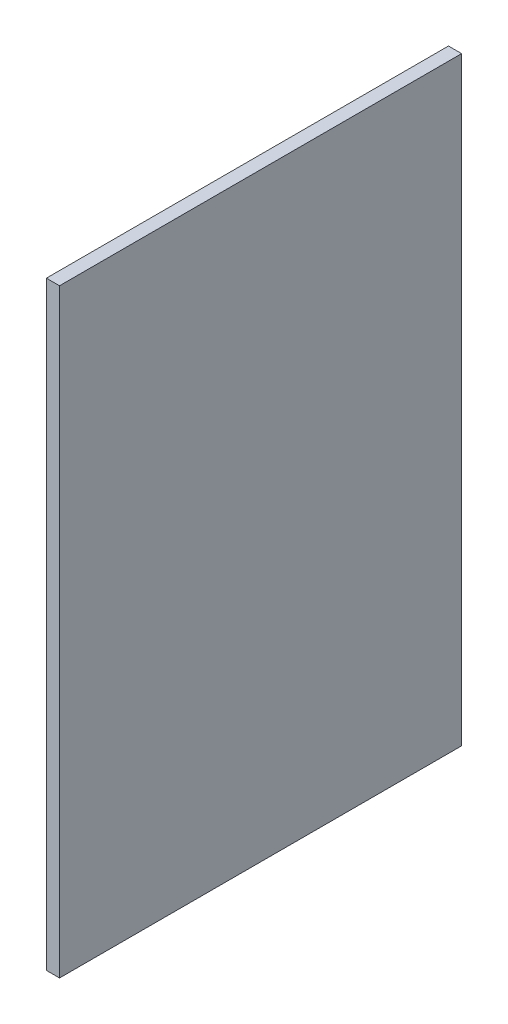
ISO-10303-21;
HEADER;
FILE_DESCRIPTION(('STEP AP214'),'2;1');
FILE_NAME('part.step','',(''),(''),'','','');
FILE_SCHEMA(('AUTOMOTIVE_DESIGN { 1 0 10303 214 1 1 1 1 }'));
ENDSEC;
DATA;
#1=APPLICATION_CONTEXT('core data for automotive mechanical design processes');
#2=APPLICATION_PROTOCOL_DEFINITION('international standard','automotive_design',2000,#1);
#3=PRODUCT_CONTEXT('',#1,'mechanical');
#4=PRODUCT('Part','Part','',(#3));
#5=PRODUCT_RELATED_PRODUCT_CATEGORY('part','',(#4));
#6=PRODUCT_DEFINITION_FORMATION('','',#4);
#7=PRODUCT_DEFINITION_CONTEXT('part definition',#1,'design');
#8=PRODUCT_DEFINITION('design','',#6,#7);
#9=PRODUCT_DEFINITION_SHAPE('','',#8);
#10=(LENGTH_UNIT() NAMED_UNIT(*) SI_UNIT(.MILLI.,.METRE.));
#11=(NAMED_UNIT(*) PLANE_ANGLE_UNIT() SI_UNIT($,.RADIAN.));
#12=(NAMED_UNIT(*) SI_UNIT($,.STERADIAN.) SOLID_ANGLE_UNIT());
#13=UNCERTAINTY_MEASURE_WITH_UNIT(LENGTH_MEASURE(1.E-05),#10,'distance_accuracy_value','');
#14=(GEOMETRIC_REPRESENTATION_CONTEXT(3) GLOBAL_UNCERTAINTY_ASSIGNED_CONTEXT((#13)) GLOBAL_UNIT_ASSIGNED_CONTEXT((#10,
#11,#12)) REPRESENTATION_CONTEXT('',''));
#15=CARTESIAN_POINT('',(0.,0.,0.));
#16=DIRECTION('',(0.,0.,1.));
#17=DIRECTION('',(1.,0.,0.));
#18=AXIS2_PLACEMENT_3D('',#15,#16,#17);
#19=CARTESIAN_POINT('',(18.,410.,-275.));
#20=DIRECTION('',(0.,0.,1.));
#21=DIRECTION('',(0.,-1.,0.));
#22=AXIS2_PLACEMENT_3D('',#19,#20,#21);
#23=PLANE('',#22);
#24=DIRECTION('',(0.,1.,0.));
#25=VECTOR('',#24,1.);
#26=CARTESIAN_POINT('',(0.,410.,-275.));
#27=LINE('',#26,#25);
#28=CARTESIAN_POINT('',(0.,-410.,-275.));
#29=VERTEX_POINT('',#28);
#30=CARTESIAN_POINT('',(0.,410.,-275.));
#31=VERTEX_POINT('',#30);
#32=EDGE_CURVE('E107',#29,#31,#27,.T.);
#33=ORIENTED_EDGE('',*,*,#32,.T.);
#34=DIRECTION('',(-1.,0.,0.));
#35=VECTOR('',#34,1.);
#36=CARTESIAN_POINT('',(18.,410.,-275.));
#37=LINE('',#36,#35);
#38=CARTESIAN_POINT('',(18.,410.,-275.));
#39=VERTEX_POINT('',#38);
#40=EDGE_CURVE('E11',#39,#31,#37,.T.);
#41=ORIENTED_EDGE('',*,*,#40,.F.);
#42=DIRECTION('',(0.,1.,0.));
#43=VECTOR('',#42,1.);
#44=CARTESIAN_POINT('',(18.,410.,-275.));
#45=LINE('',#44,#43);
#46=CARTESIAN_POINT('',(18.,-410.,-275.));
#47=VERTEX_POINT('',#46);
#48=EDGE_CURVE('E91',#47,#39,#45,.T.);
#49=ORIENTED_EDGE('',*,*,#48,.F.);
#50=DIRECTION('',(-1.,0.,0.));
#51=VECTOR('',#50,1.);
#52=CARTESIAN_POINT('',(18.,-410.,-275.));
#53=LINE('',#52,#51);
#54=EDGE_CURVE('E103',#47,#29,#53,.T.);
#55=ORIENTED_EDGE('',*,*,#54,.T.);
#56=EDGE_LOOP('',(#33,#41,#49,#55));
#57=FACE_BOUND('',#56,.T.);
#58=ADVANCED_FACE('F39',(#57),#23,.F.);
#59=CARTESIAN_POINT('',(18.,410.,275.));
#60=DIRECTION('',(0.,-1.,0.));
#61=DIRECTION('',(0.,0.,-1.));
#62=AXIS2_PLACEMENT_3D('',#59,#60,#61);
#63=PLANE('',#62);
#64=DIRECTION('',(0.,0.,1.));
#65=VECTOR('',#64,1.);
#66=CARTESIAN_POINT('',(0.,410.,275.));
#67=LINE('',#66,#65);
#68=CARTESIAN_POINT('',(0.,410.,275.));
#69=VERTEX_POINT('',#68);
#70=EDGE_CURVE('E96',#31,#69,#67,.T.);
#71=ORIENTED_EDGE('',*,*,#70,.T.);
#72=DIRECTION('',(-1.,0.,0.));
#73=VECTOR('',#72,1.);
#74=CARTESIAN_POINT('',(18.,410.,275.));
#75=LINE('',#74,#73);
#76=CARTESIAN_POINT('',(18.,410.,275.));
#77=VERTEX_POINT('',#76);
#78=EDGE_CURVE('E48',#77,#69,#75,.T.);
#79=ORIENTED_EDGE('',*,*,#78,.F.);
#80=DIRECTION('',(0.,0.,1.));
#81=VECTOR('',#80,1.);
#82=CARTESIAN_POINT('',(18.,410.,275.));
#83=LINE('',#82,#81);
#84=EDGE_CURVE('E86',#39,#77,#83,.T.);
#85=ORIENTED_EDGE('',*,*,#84,.F.);
#86=ORIENTED_EDGE('',*,*,#40,.T.);
#87=EDGE_LOOP('',(#71,#79,#85,#86));
#88=FACE_BOUND('',#87,.T.);
#89=ADVANCED_FACE('F95',(#88),#63,.F.);
#90=CARTESIAN_POINT('',(18.,410.,275.));
#91=DIRECTION('',(0.,0.,-1.));
#92=DIRECTION('',(0.,1.,0.));
#93=AXIS2_PLACEMENT_3D('',#90,#91,#92);
#94=PLANE('',#93);
#95=DIRECTION('',(0.,-1.,0.));
#96=VECTOR('',#95,1.);
#97=CARTESIAN_POINT('',(0.,410.,275.));
#98=LINE('',#97,#96);
#99=CARTESIAN_POINT('',(0.,-410.,275.));
#100=VERTEX_POINT('',#99);
#101=EDGE_CURVE('E73',#69,#100,#98,.T.);
#102=ORIENTED_EDGE('',*,*,#101,.T.);
#103=DIRECTION('',(-1.,0.,0.));
#104=VECTOR('',#103,1.);
#105=CARTESIAN_POINT('',(18.,-410.,275.));
#106=LINE('',#105,#104);
#107=CARTESIAN_POINT('',(18.,-410.,275.));
#108=VERTEX_POINT('',#107);
#109=EDGE_CURVE('E98',#108,#100,#106,.T.);
#110=ORIENTED_EDGE('',*,*,#109,.F.);
#111=DIRECTION('',(0.,-1.,0.));
#112=VECTOR('',#111,1.);
#113=CARTESIAN_POINT('',(18.,410.,275.));
#114=LINE('',#113,#112);
#115=EDGE_CURVE('E89',#77,#108,#114,.T.);
#116=ORIENTED_EDGE('',*,*,#115,.F.);
#117=ORIENTED_EDGE('',*,*,#78,.T.);
#118=EDGE_LOOP('',(#102,#110,#116,#117));
#119=FACE_BOUND('',#118,.T.);
#120=ADVANCED_FACE('F99',(#119),#94,.F.);
#121=CARTESIAN_POINT('',(18.,-410.,275.));
#122=DIRECTION('',(0.,1.,0.));
#123=DIRECTION('',(0.,0.,1.));
#124=AXIS2_PLACEMENT_3D('',#121,#122,#123);
#125=PLANE('',#124);
#126=DIRECTION('',(0.,0.,-1.));
#127=VECTOR('',#126,1.);
#128=CARTESIAN_POINT('',(0.,-410.,275.));
#129=LINE('',#128,#127);
#130=EDGE_CURVE('E79',#100,#29,#129,.T.);
#131=ORIENTED_EDGE('',*,*,#130,.T.);
#132=ORIENTED_EDGE('',*,*,#54,.F.);
#133=DIRECTION('',(0.,0.,-1.));
#134=VECTOR('',#133,1.);
#135=CARTESIAN_POINT('',(18.,-410.,275.));
#136=LINE('',#135,#134);
#137=EDGE_CURVE('E56',#108,#47,#136,.T.);
#138=ORIENTED_EDGE('',*,*,#137,.F.);
#139=ORIENTED_EDGE('',*,*,#109,.T.);
#140=EDGE_LOOP('',(#131,#132,#138,#139));
#141=FACE_BOUND('',#140,.T.);
#142=ADVANCED_FACE('F120',(#141),#125,.F.);
#143=CARTESIAN_POINT('',(18.,0.,0.));
#144=DIRECTION('',(1.,0.,0.));
#145=DIRECTION('',(0.,0.,-1.));
#146=AXIS2_PLACEMENT_3D('',#143,#144,#145);
#147=PLANE('',#146);
#148=ORIENTED_EDGE('',*,*,#48,.T.);
#149=ORIENTED_EDGE('',*,*,#84,.T.);
#150=ORIENTED_EDGE('',*,*,#115,.T.);
#151=ORIENTED_EDGE('',*,*,#137,.T.);
#152=EDGE_LOOP('',(#148,#149,#150,#151));
#153=FACE_BOUND('',#152,.T.);
#154=ADVANCED_FACE('F87',(#153),#147,.T.);
#155=CARTESIAN_POINT('',(0.,0.,0.));
#156=DIRECTION('',(1.,0.,0.));
#157=DIRECTION('',(0.,0.,-1.));
#158=AXIS2_PLACEMENT_3D('',#155,#156,#157);
#159=PLANE('',#158);
#160=ORIENTED_EDGE('',*,*,#32,.F.);
#161=ORIENTED_EDGE('',*,*,#130,.F.);
#162=ORIENTED_EDGE('',*,*,#101,.F.);
#163=ORIENTED_EDGE('',*,*,#70,.F.);
#164=EDGE_LOOP('',(#160,#161,#162,#163));
#165=FACE_BOUND('',#164,.T.);
#166=ADVANCED_FACE('F123',(#165),#159,.F.);
#167=CLOSED_SHELL('',(#58,#89,#120,#142,#154,#166));
#168=MANIFOLD_SOLID_BREP('B2',#167);
#169=ADVANCED_BREP_SHAPE_REPRESENTATION('',(#18,#168),#14);
#170=SHAPE_DEFINITION_REPRESENTATION(#9,#169);
ENDSEC;
END-ISO-10303-21;
